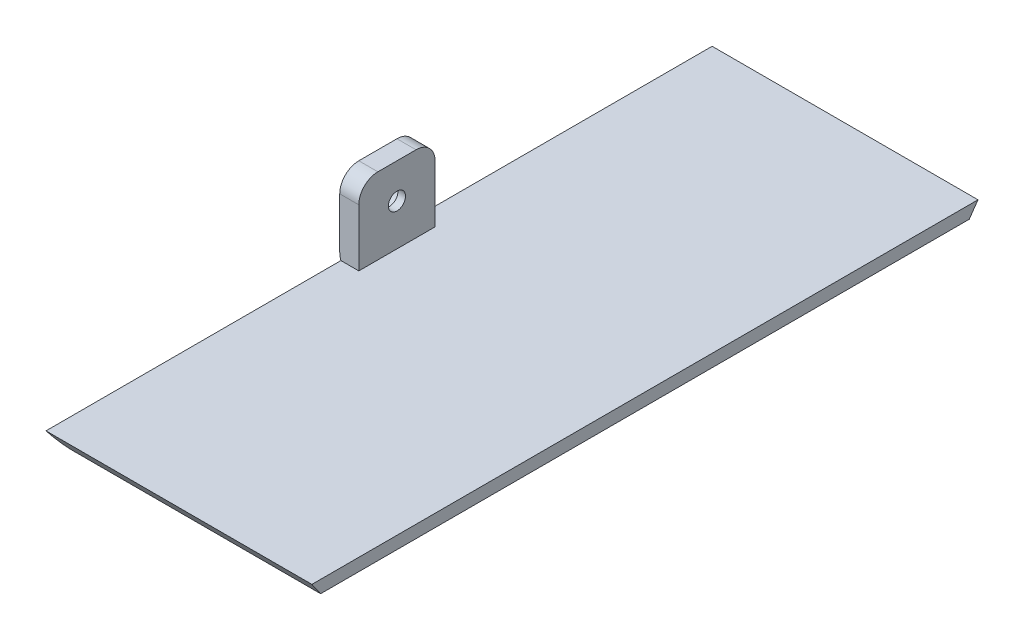
ISO-10303-21;
HEADER;
FILE_DESCRIPTION(('STEP AP214'),'2;1');
FILE_NAME('part.step','',(''),(''),'','','');
FILE_SCHEMA(('AUTOMOTIVE_DESIGN { 1 0 10303 214 1 1 1 1 }'));
ENDSEC;
DATA;
#1=APPLICATION_CONTEXT('core data for automotive mechanical design processes');
#2=APPLICATION_PROTOCOL_DEFINITION('international standard','automotive_design',2000,#1);
#3=PRODUCT_CONTEXT('',#1,'mechanical');
#4=PRODUCT('Part','Part','',(#3));
#5=PRODUCT_RELATED_PRODUCT_CATEGORY('part','',(#4));
#6=PRODUCT_DEFINITION_FORMATION('','',#4);
#7=PRODUCT_DEFINITION_CONTEXT('part definition',#1,'design');
#8=PRODUCT_DEFINITION('design','',#6,#7);
#9=PRODUCT_DEFINITION_SHAPE('','',#8);
#10=(LENGTH_UNIT() NAMED_UNIT(*) SI_UNIT(.MILLI.,.METRE.));
#11=(NAMED_UNIT(*) PLANE_ANGLE_UNIT() SI_UNIT($,.RADIAN.));
#12=(NAMED_UNIT(*) SI_UNIT($,.STERADIAN.) SOLID_ANGLE_UNIT());
#13=UNCERTAINTY_MEASURE_WITH_UNIT(LENGTH_MEASURE(1.E-05),#10,'distance_accuracy_value','');
#14=(GEOMETRIC_REPRESENTATION_CONTEXT(3) GLOBAL_UNCERTAINTY_ASSIGNED_CONTEXT((#13)) GLOBAL_UNIT_ASSIGNED_CONTEXT((#10,
#11,#12)) REPRESENTATION_CONTEXT('',''));
#15=CARTESIAN_POINT('',(0.,0.,0.));
#16=DIRECTION('',(0.,0.,1.));
#17=DIRECTION('',(1.,0.,0.));
#18=AXIS2_PLACEMENT_3D('',#15,#16,#17);
#19=CARTESIAN_POINT('',(70.001,12.5,2.65412691824451E-13));
#20=DIRECTION('',(-1.,0.,0.));
#21=DIRECTION('',(0.,0.,1.));
#22=AXIS2_PLACEMENT_3D('',#19,#20,#21);
#23=CYLINDRICAL_SURFACE('',#22,2.25);
#24=CARTESIAN_POINT('',(4.99999999999989,12.5,2.65412691824451E-13));
#25=DIRECTION('',(-1.,0.,0.));
#26=DIRECTION('',(0.,0.,1.));
#27=AXIS2_PLACEMENT_3D('',#24,#25,#26);
#28=CIRCLE('',#27,2.25);
#29=CARTESIAN_POINT('',(4.99999999999989,12.5,2.25000000000027));
#30=VERTEX_POINT('',#29);
#31=EDGE_CURVE('E173',#30,#30,#28,.F.);
#32=ORIENTED_EDGE('',*,*,#31,.T.);
#33=EDGE_LOOP('',(#32));
#34=FACE_BOUND('',#33,.T.);
#35=CARTESIAN_POINT('',(3.,12.5,2.65412691824451E-13));
#36=DIRECTION('',(-1.,0.,0.));
#37=DIRECTION('',(0.,0.,1.));
#38=AXIS2_PLACEMENT_3D('',#35,#36,#37);
#39=CIRCLE('',#38,2.25);
#40=CARTESIAN_POINT('',(3.,12.5,2.25000000000027));
#41=VERTEX_POINT('',#40);
#42=EDGE_CURVE('E228',#41,#41,#39,.F.);
#43=ORIENTED_EDGE('',*,*,#42,.F.);
#44=EDGE_LOOP('',(#43));
#45=FACE_BOUND('',#44,.T.);
#46=ADVANCED_FACE('F73',(#34,#45),#23,.F.);
#47=CARTESIAN_POINT('',(70.,1.63830408857799,-87.2943057454042));
#48=DIRECTION('',(0.,-1.,0.));
#49=DIRECTION('',(0.,0.,-1.));
#50=AXIS2_PLACEMENT_3D('',#47,#48,#49);
#51=PLANE('',#50);
#52=DIRECTION('',(0.,0.,1.));
#53=VECTOR('',#52,1.);
#54=CARTESIAN_POINT('',(0.30639577457211,1.63830408857799,-87.2943057454042));
#55=LINE('',#54,#53);
#56=CARTESIAN_POINT('',(0.306395774572101,1.63830408857801,87.2943057454042));
#57=VERTEX_POINT('',#56);
#58=CARTESIAN_POINT('',(0.30639577457211,1.63830408857799,10.0000000000003));
#59=VERTEX_POINT('',#58);
#60=EDGE_CURVE('E183',#57,#59,#55,.F.);
#61=ORIENTED_EDGE('',*,*,#60,.F.);
#62=DIRECTION('',(-1.,0.,0.));
#63=VECTOR('',#62,1.);
#64=CARTESIAN_POINT('',(70.,1.63830408857799,87.2943057454042));
#65=LINE('',#64,#63);
#66=CARTESIAN_POINT('',(70.,1.63830408857799,87.2943057454042));
#67=VERTEX_POINT('',#66);
#68=EDGE_CURVE('E217',#67,#57,#65,.T.);
#69=ORIENTED_EDGE('',*,*,#68,.F.);
#70=DIRECTION('',(0.,0.,1.));
#71=VECTOR('',#70,1.);
#72=CARTESIAN_POINT('',(70.,1.63830408857799,-87.2943057454042));
#73=LINE('',#72,#71);
#74=CARTESIAN_POINT('',(70.,1.63830408857799,-87.2943057454042));
#75=VERTEX_POINT('',#74);
#76=EDGE_CURVE('E211',#75,#67,#73,.T.);
#77=ORIENTED_EDGE('',*,*,#76,.F.);
#78=DIRECTION('',(-1.,0.,0.));
#79=VECTOR('',#78,1.);
#80=CARTESIAN_POINT('',(70.,1.63830408857799,-87.2943057454042));
#81=LINE('',#80,#79);
#82=CARTESIAN_POINT('',(0.30639577457211,1.63830408857799,-87.2943057454042));
#83=VERTEX_POINT('',#82);
#84=EDGE_CURVE('E222',#75,#83,#81,.T.);
#85=ORIENTED_EDGE('',*,*,#84,.T.);
#86=CARTESIAN_POINT('',(0.30639577457211,1.63830408857799,-9.99999999999973));
#87=VERTEX_POINT('',#86);
#88=EDGE_CURVE('E179',#87,#83,#55,.F.);
#89=ORIENTED_EDGE('',*,*,#88,.F.);
#90=DIRECTION('',(-1.,0.,0.));
#91=VECTOR('',#90,1.);
#92=CARTESIAN_POINT('',(4.9999999999999,1.63830408857799,-9.99999999999973));
#93=LINE('',#92,#91);
#94=CARTESIAN_POINT('',(4.9999999999999,1.63830408857799,-9.99999999999973));
#95=VERTEX_POINT('',#94);
#96=EDGE_CURVE('E177',#95,#87,#93,.T.);
#97=ORIENTED_EDGE('',*,*,#96,.F.);
#98=DIRECTION('',(0.,0.,-1.));
#99=VECTOR('',#98,1.);
#100=CARTESIAN_POINT('',(4.9999999999999,1.63830408857799,10.0000000000003));
#101=LINE('',#100,#99);
#102=CARTESIAN_POINT('',(4.9999999999999,1.63830408857799,10.0000000000003));
#103=VERTEX_POINT('',#102);
#104=EDGE_CURVE('E188',#103,#95,#101,.T.);
#105=ORIENTED_EDGE('',*,*,#104,.F.);
#106=DIRECTION('',(1.,0.,0.));
#107=VECTOR('',#106,1.);
#108=CARTESIAN_POINT('',(4.9999999999999,1.63830408857799,10.0000000000003));
#109=LINE('',#108,#107);
#110=EDGE_CURVE('E192',#59,#103,#109,.T.);
#111=ORIENTED_EDGE('',*,*,#110,.F.);
#112=EDGE_LOOP('',(#61,#69,#77,#85,#89,#97,#105,#111));
#113=FACE_BOUND('',#112,.T.);
#114=ADVANCED_FACE('F256',(#113),#51,.F.);
#115=CARTESIAN_POINT('',(70.,-1.63830408857799,-85.));
#116=DIRECTION('',(0.,1.,0.));
#117=DIRECTION('',(0.,0.,1.));
#118=AXIS2_PLACEMENT_3D('',#115,#116,#117);
#119=PLANE('',#118);
#120=DIRECTION('',(0.,0.,1.));
#121=VECTOR('',#120,1.);
#122=CARTESIAN_POINT('',(4.99999999999989,-1.6383040885779,-87.2943057454042));
#123=LINE('',#122,#121);
#124=CARTESIAN_POINT('',(4.99999999999989,-1.6383040885779,-85.));
#125=VERTEX_POINT('',#124);
#126=CARTESIAN_POINT('',(4.99999999999989,-1.6383040885779,85.));
#127=VERTEX_POINT('',#126);
#128=EDGE_CURVE('E174',#125,#127,#123,.T.);
#129=ORIENTED_EDGE('',*,*,#128,.F.);
#130=DIRECTION('',(-1.,0.,0.));
#131=VECTOR('',#130,1.);
#132=CARTESIAN_POINT('',(70.,-1.63830408857799,-85.));
#133=LINE('',#132,#131);
#134=CARTESIAN_POINT('',(70.,-1.63830408857799,-85.));
#135=VERTEX_POINT('',#134);
#136=EDGE_CURVE('E221',#135,#125,#133,.T.);
#137=ORIENTED_EDGE('',*,*,#136,.F.);
#138=DIRECTION('',(0.,0.,-1.));
#139=VECTOR('',#138,1.);
#140=CARTESIAN_POINT('',(70.,-1.63830408857799,-85.));
#141=LINE('',#140,#139);
#142=CARTESIAN_POINT('',(70.,-1.63830408857799,85.));
#143=VERTEX_POINT('',#142);
#144=EDGE_CURVE('E206',#143,#135,#141,.T.);
#145=ORIENTED_EDGE('',*,*,#144,.F.);
#146=DIRECTION('',(-1.,0.,0.));
#147=VECTOR('',#146,1.);
#148=CARTESIAN_POINT('',(70.,-1.63830408857799,85.));
#149=LINE('',#148,#147);
#150=EDGE_CURVE('E214',#143,#127,#149,.T.);
#151=ORIENTED_EDGE('',*,*,#150,.T.);
#152=EDGE_LOOP('',(#129,#137,#145,#151));
#153=FACE_BOUND('',#152,.T.);
#154=ADVANCED_FACE('F274',(#153),#119,.F.);
#155=CARTESIAN_POINT('',(70.,-1.63830408857799,-85.));
#156=DIRECTION('',(0.,0.573576436351049,0.819152044288989));
#157=DIRECTION('',(0.,-0.819152044288989,0.573576436351049));
#158=AXIS2_PLACEMENT_3D('',#155,#156,#157);
#159=PLANE('',#158);
#160=CARTESIAN_POINT('',(4.99999999999989,3.3616959114221,-88.5010376910486));
#161=DIRECTION('',(0.,0.573576436351049,0.819152044288989));
#162=DIRECTION('',(0.,-0.819152044288989,0.573576436351049));
#163=AXIS2_PLACEMENT_3D('',#160,#161,#162);
#164=ELLIPSE('',#163,6.10387294380723,4.99999999999994);
#165=EDGE_CURVE('E181',#83,#125,#164,.T.);
#166=ORIENTED_EDGE('',*,*,#165,.F.);
#167=ORIENTED_EDGE('',*,*,#84,.F.);
#168=DIRECTION('',(0.,0.819152044288989,-0.573576436351049));
#169=VECTOR('',#168,1.);
#170=CARTESIAN_POINT('',(70.,-1.63830408857799,-85.));
#171=LINE('',#170,#169);
#172=EDGE_CURVE('E207',#135,#75,#171,.T.);
#173=ORIENTED_EDGE('',*,*,#172,.F.);
#174=ORIENTED_EDGE('',*,*,#136,.T.);
#175=EDGE_LOOP('',(#166,#167,#173,#174));
#176=FACE_BOUND('',#175,.T.);
#177=ADVANCED_FACE('F305',(#176),#159,.F.);
#178=CARTESIAN_POINT('',(70.,-1.63830408857799,85.));
#179=DIRECTION('',(0.,0.573576436351049,-0.819152044288989));
#180=DIRECTION('',(0.,0.819152044288989,0.573576436351049));
#181=AXIS2_PLACEMENT_3D('',#178,#179,#180);
#182=PLANE('',#181);
#183=CARTESIAN_POINT('',(4.99999999999989,3.3616959114221,88.5010376910486));
#184=DIRECTION('',(0.,0.573576436351049,-0.819152044288989));
#185=DIRECTION('',(0.,0.819152044288989,0.573576436351049));
#186=AXIS2_PLACEMENT_3D('',#183,#184,#185);
#187=ELLIPSE('',#186,6.10387294380723,4.99999999999994);
#188=EDGE_CURVE('E182',#127,#57,#187,.T.);
#189=ORIENTED_EDGE('',*,*,#188,.F.);
#190=ORIENTED_EDGE('',*,*,#150,.F.);
#191=DIRECTION('',(0.,-0.819152044288989,-0.573576436351049));
#192=VECTOR('',#191,1.);
#193=CARTESIAN_POINT('',(70.,-1.63830408857799,85.));
#194=LINE('',#193,#192);
#195=EDGE_CURVE('E213',#67,#143,#194,.T.);
#196=ORIENTED_EDGE('',*,*,#195,.F.);
#197=ORIENTED_EDGE('',*,*,#68,.T.);
#198=EDGE_LOOP('',(#189,#190,#196,#197));
#199=FACE_BOUND('',#198,.T.);
#200=ADVANCED_FACE('F298',(#199),#182,.F.);
#201=CARTESIAN_POINT('',(0.,0.,0.));
#202=DIRECTION('',(-1.,0.,0.));
#203=DIRECTION('',(0.,0.,1.));
#204=AXIS2_PLACEMENT_3D('',#201,#202,#203);
#205=PLANE('',#204);
#206=CARTESIAN_POINT('',(0.,12.5,2.65412691824451E-13));
#207=DIRECTION('',(-1.,0.,0.));
#208=DIRECTION('',(0.,0.,1.));
#209=AXIS2_PLACEMENT_3D('',#206,#207,#208);
#210=CIRCLE('',#209,3.75);
#211=CARTESIAN_POINT('',(0.,12.5,3.75000000000027));
#212=VERTEX_POINT('',#211);
#213=EDGE_CURVE('E324',#212,#212,#210,.T.);
#214=ORIENTED_EDGE('',*,*,#213,.F.);
#215=EDGE_LOOP('',(#214));
#216=FACE_BOUND('',#215,.T.);
#217=DIRECTION('',(0.,-1.,0.));
#218=VECTOR('',#217,1.);
#219=CARTESIAN_POINT('',(0.,21.638304088578,10.0000000000003));
#220=LINE('',#219,#218);
#221=CARTESIAN_POINT('',(0.,16.638304088578,10.0000000000003));
#222=VERTEX_POINT('',#221);
#223=CARTESIAN_POINT('',(0.,3.36169591142201,10.0000000000003));
#224=VERTEX_POINT('',#223);
#225=EDGE_CURVE('E163',#222,#224,#220,.T.);
#226=ORIENTED_EDGE('',*,*,#225,.F.);
#227=CARTESIAN_POINT('',(0.,16.638304088578,5.00000000000026));
#228=DIRECTION('',(-1.,0.,0.));
#229=DIRECTION('',(0.,0.,1.));
#230=AXIS2_PLACEMENT_3D('',#227,#228,#229);
#231=CIRCLE('',#230,5.);
#232=CARTESIAN_POINT('',(0.,21.638304088578,5.00000000000026));
#233=VERTEX_POINT('',#232);
#234=EDGE_CURVE('E83',#222,#233,#231,.T.);
#235=ORIENTED_EDGE('',*,*,#234,.T.);
#236=DIRECTION('',(0.,0.,1.));
#237=VECTOR('',#236,1.);
#238=CARTESIAN_POINT('',(0.,21.638304088578,10.0000000000003));
#239=LINE('',#238,#237);
#240=CARTESIAN_POINT('',(0.,21.638304088578,-4.99999999999973));
#241=VERTEX_POINT('',#240);
#242=EDGE_CURVE('E193',#241,#233,#239,.T.);
#243=ORIENTED_EDGE('',*,*,#242,.F.);
#244=CARTESIAN_POINT('',(0.,16.638304088578,-4.99999999999973));
#245=DIRECTION('',(-1.,0.,0.));
#246=DIRECTION('',(0.,0.,1.));
#247=AXIS2_PLACEMENT_3D('',#244,#245,#246);
#248=CIRCLE('',#247,5.);
#249=CARTESIAN_POINT('',(0.,16.638304088578,-9.99999999999973));
#250=VERTEX_POINT('',#249);
#251=EDGE_CURVE('E89',#241,#250,#248,.T.);
#252=ORIENTED_EDGE('',*,*,#251,.T.);
#253=DIRECTION('',(0.,-1.,0.));
#254=VECTOR('',#253,1.);
#255=CARTESIAN_POINT('',(0.,21.638304088578,-9.99999999999973));
#256=LINE('',#255,#254);
#257=CARTESIAN_POINT('',(0.,3.36169591142201,-9.99999999999973));
#258=VERTEX_POINT('',#257);
#259=EDGE_CURVE('E156',#250,#258,#256,.T.);
#260=ORIENTED_EDGE('',*,*,#259,.T.);
#261=DIRECTION('',(0.,0.,1.));
#262=VECTOR('',#261,1.);
#263=CARTESIAN_POINT('',(0.,3.36169591142201,-87.2943057454042));
#264=LINE('',#263,#262);
#265=EDGE_CURVE('E157',#258,#224,#264,.T.);
#266=ORIENTED_EDGE('',*,*,#265,.T.);
#267=EDGE_LOOP('',(#226,#235,#243,#252,#260,#266));
#268=FACE_BOUND('',#267,.T.);
#269=ADVANCED_FACE('F158',(#216,#268),#205,.T.);
#270=CARTESIAN_POINT('',(4.9999999999999,21.638304088578,-9.99999999999973));
#271=DIRECTION('',(0.,0.,1.));
#272=DIRECTION('',(1.,0.,0.));
#273=AXIS2_PLACEMENT_3D('',#270,#271,#272);
#274=PLANE('',#273);
#275=ORIENTED_EDGE('',*,*,#259,.F.);
#276=DIRECTION('',(-1.,0.,0.));
#277=VECTOR('',#276,1.);
#278=CARTESIAN_POINT('',(4.9999999999999,16.638304088578,-9.99999999999973));
#279=LINE('',#278,#277);
#280=CARTESIAN_POINT('',(4.9999999999999,16.638304088578,-9.99999999999973));
#281=VERTEX_POINT('',#280);
#282=EDGE_CURVE('E12',#250,#281,#279,.F.);
#283=ORIENTED_EDGE('',*,*,#282,.T.);
#284=DIRECTION('',(0.,-1.,0.));
#285=VECTOR('',#284,1.);
#286=CARTESIAN_POINT('',(4.9999999999999,21.638304088578,-9.99999999999973));
#287=LINE('',#286,#285);
#288=EDGE_CURVE('E162',#281,#95,#287,.T.);
#289=ORIENTED_EDGE('',*,*,#288,.T.);
#290=ORIENTED_EDGE('',*,*,#96,.T.);
#291=CARTESIAN_POINT('',(4.99999999999989,3.3616959114221,-9.99999999999973));
#292=DIRECTION('',(0.,0.,1.));
#293=DIRECTION('',(1.,0.,0.));
#294=AXIS2_PLACEMENT_3D('',#291,#292,#293);
#295=CIRCLE('',#294,4.99999999999994);
#296=EDGE_CURVE('E166',#258,#87,#295,.T.);
#297=ORIENTED_EDGE('',*,*,#296,.F.);
#298=EDGE_LOOP('',(#275,#283,#289,#290,#297));
#299=FACE_BOUND('',#298,.T.);
#300=ADVANCED_FACE('F180',(#299),#274,.F.);
#301=CARTESIAN_POINT('',(4.9999999999999,21.638304088578,10.0000000000003));
#302=DIRECTION('',(0.,0.,-1.));
#303=DIRECTION('',(-1.,0.,0.));
#304=AXIS2_PLACEMENT_3D('',#301,#302,#303);
#305=PLANE('',#304);
#306=DIRECTION('',(0.,-1.,0.));
#307=VECTOR('',#306,1.);
#308=CARTESIAN_POINT('',(4.9999999999999,21.638304088578,10.0000000000003));
#309=LINE('',#308,#307);
#310=CARTESIAN_POINT('',(4.9999999999999,16.638304088578,10.0000000000003));
#311=VERTEX_POINT('',#310);
#312=EDGE_CURVE('E197',#311,#103,#309,.T.);
#313=ORIENTED_EDGE('',*,*,#312,.F.);
#314=DIRECTION('',(1.,0.,0.));
#315=VECTOR('',#314,1.);
#316=CARTESIAN_POINT('',(0.,16.638304088578,10.0000000000003));
#317=LINE('',#316,#315);
#318=EDGE_CURVE('E98',#311,#222,#317,.F.);
#319=ORIENTED_EDGE('',*,*,#318,.T.);
#320=ORIENTED_EDGE('',*,*,#225,.T.);
#321=CARTESIAN_POINT('',(4.99999999999989,3.3616959114221,10.0000000000003));
#322=DIRECTION('',(0.,0.,-1.));
#323=DIRECTION('',(-1.,0.,0.));
#324=AXIS2_PLACEMENT_3D('',#321,#322,#323);
#325=CIRCLE('',#324,4.99999999999994);
#326=EDGE_CURVE('E172',#59,#224,#325,.T.);
#327=ORIENTED_EDGE('',*,*,#326,.F.);
#328=ORIENTED_EDGE('',*,*,#110,.T.);
#329=EDGE_LOOP('',(#313,#319,#320,#327,#328));
#330=FACE_BOUND('',#329,.T.);
#331=ADVANCED_FACE('F251',(#330),#305,.F.);
#332=CARTESIAN_POINT('',(70.,0.,0.));
#333=DIRECTION('',(-1.,0.,0.));
#334=DIRECTION('',(0.,0.,1.));
#335=AXIS2_PLACEMENT_3D('',#332,#333,#334);
#336=PLANE('',#335);
#337=ORIENTED_EDGE('',*,*,#144,.T.);
#338=ORIENTED_EDGE('',*,*,#172,.T.);
#339=ORIENTED_EDGE('',*,*,#76,.T.);
#340=ORIENTED_EDGE('',*,*,#195,.T.);
#341=EDGE_LOOP('',(#337,#338,#339,#340));
#342=FACE_BOUND('',#341,.T.);
#343=ADVANCED_FACE('F288',(#342),#336,.F.);
#344=CARTESIAN_POINT('',(4.9999999999999,21.638304088578,10.0000000000003));
#345=DIRECTION('',(-1.,0.,0.));
#346=DIRECTION('',(0.,0.,1.));
#347=AXIS2_PLACEMENT_3D('',#344,#345,#346);
#348=PLANE('',#347);
#349=ORIENTED_EDGE('',*,*,#31,.F.);
#350=EDGE_LOOP('',(#349));
#351=FACE_BOUND('',#350,.T.);
#352=DIRECTION('',(0.,0.,-1.));
#353=VECTOR('',#352,1.);
#354=CARTESIAN_POINT('',(4.9999999999999,21.638304088578,10.0000000000003));
#355=LINE('',#354,#353);
#356=CARTESIAN_POINT('',(4.9999999999999,21.638304088578,5.00000000000026));
#357=VERTEX_POINT('',#356);
#358=CARTESIAN_POINT('',(4.9999999999999,21.638304088578,-4.99999999999973));
#359=VERTEX_POINT('',#358);
#360=EDGE_CURVE('E190',#357,#359,#355,.T.);
#361=ORIENTED_EDGE('',*,*,#360,.F.);
#362=CARTESIAN_POINT('',(4.9999999999999,16.638304088578,5.00000000000026));
#363=DIRECTION('',(-1.,0.,0.));
#364=DIRECTION('',(0.,0.,1.));
#365=AXIS2_PLACEMENT_3D('',#362,#363,#364);
#366=CIRCLE('',#365,5.);
#367=EDGE_CURVE('E238',#357,#311,#366,.F.);
#368=ORIENTED_EDGE('',*,*,#367,.T.);
#369=ORIENTED_EDGE('',*,*,#312,.T.);
#370=ORIENTED_EDGE('',*,*,#104,.T.);
#371=ORIENTED_EDGE('',*,*,#288,.F.);
#372=CARTESIAN_POINT('',(4.9999999999999,16.638304088578,-4.99999999999973));
#373=DIRECTION('',(-1.,0.,0.));
#374=DIRECTION('',(0.,0.,1.));
#375=AXIS2_PLACEMENT_3D('',#372,#373,#374);
#376=CIRCLE('',#375,5.);
#377=EDGE_CURVE('E236',#281,#359,#376,.F.);
#378=ORIENTED_EDGE('',*,*,#377,.T.);
#379=EDGE_LOOP('',(#361,#368,#369,#370,#371,#378));
#380=FACE_BOUND('',#379,.T.);
#381=ADVANCED_FACE('F252',(#351,#380),#348,.F.);
#382=CARTESIAN_POINT('',(0.,21.638304088578,0.));
#383=DIRECTION('',(0.,1.,0.));
#384=DIRECTION('',(0.,0.,1.));
#385=AXIS2_PLACEMENT_3D('',#382,#383,#384);
#386=PLANE('',#385);
#387=ORIENTED_EDGE('',*,*,#242,.T.);
#388=DIRECTION('',(1.,0.,0.));
#389=VECTOR('',#388,1.);
#390=CARTESIAN_POINT('',(4.9999999999999,21.638304088578,5.00000000000026));
#391=LINE('',#390,#389);
#392=EDGE_CURVE('E234',#233,#357,#391,.T.);
#393=ORIENTED_EDGE('',*,*,#392,.T.);
#394=ORIENTED_EDGE('',*,*,#360,.T.);
#395=DIRECTION('',(-1.,0.,0.));
#396=VECTOR('',#395,1.);
#397=CARTESIAN_POINT('',(0.,21.638304088578,-4.99999999999973));
#398=LINE('',#397,#396);
#399=EDGE_CURVE('E229',#359,#241,#398,.T.);
#400=ORIENTED_EDGE('',*,*,#399,.T.);
#401=EDGE_LOOP('',(#387,#393,#394,#400));
#402=FACE_BOUND('',#401,.T.);
#403=ADVANCED_FACE('F250',(#402),#386,.T.);
#404=CARTESIAN_POINT('',(4.99999999999989,3.3616959114221,-87.2943057454042));
#405=DIRECTION('',(0.,0.,1.));
#406=DIRECTION('',(1.,0.,0.));
#407=AXIS2_PLACEMENT_3D('',#404,#405,#406);
#408=CYLINDRICAL_SURFACE('',#407,4.99999999999994);
#409=ORIENTED_EDGE('',*,*,#165,.T.);
#410=ORIENTED_EDGE('',*,*,#128,.T.);
#411=ORIENTED_EDGE('',*,*,#188,.T.);
#412=ORIENTED_EDGE('',*,*,#60,.T.);
#413=ORIENTED_EDGE('',*,*,#326,.T.);
#414=ORIENTED_EDGE('',*,*,#265,.F.);
#415=ORIENTED_EDGE('',*,*,#296,.T.);
#416=ORIENTED_EDGE('',*,*,#88,.T.);
#417=EDGE_LOOP('',(#409,#410,#411,#412,#413,#414,#415,#416));
#418=FACE_BOUND('',#417,.T.);
#419=ADVANCED_FACE('F169',(#418),#408,.T.);
#420=CARTESIAN_POINT('',(3.,12.5,2.65412691824451E-13));
#421=DIRECTION('',(-1.,0.,0.));
#422=DIRECTION('',(0.,0.,1.));
#423=AXIS2_PLACEMENT_3D('',#420,#421,#422);
#424=PLANE('',#423);
#425=CARTESIAN_POINT('',(3.,12.5,2.65412691824451E-13));
#426=DIRECTION('',(-1.,0.,0.));
#427=DIRECTION('',(0.,0.,1.));
#428=AXIS2_PLACEMENT_3D('',#425,#426,#427);
#429=CIRCLE('',#428,3.75);
#430=CARTESIAN_POINT('',(3.,12.5,3.75000000000027));
#431=VERTEX_POINT('',#430);
#432=EDGE_CURVE('E235',#431,#431,#429,.T.);
#433=ORIENTED_EDGE('',*,*,#432,.T.);
#434=EDGE_LOOP('',(#433));
#435=FACE_BOUND('',#434,.T.);
#436=ORIENTED_EDGE('',*,*,#42,.T.);
#437=EDGE_LOOP('',(#436));
#438=FACE_BOUND('',#437,.T.);
#439=ADVANCED_FACE('F284',(#435,#438),#424,.T.);
#440=CARTESIAN_POINT('',(3.,12.5,2.65412691824451E-13));
#441=DIRECTION('',(-1.,0.,0.));
#442=DIRECTION('',(0.,0.,1.));
#443=AXIS2_PLACEMENT_3D('',#440,#441,#442);
#444=CYLINDRICAL_SURFACE('',#443,3.75);
#445=ORIENTED_EDGE('',*,*,#432,.F.);
#446=EDGE_LOOP('',(#445));
#447=FACE_BOUND('',#446,.T.);
#448=ORIENTED_EDGE('',*,*,#213,.T.);
#449=EDGE_LOOP('',(#448));
#450=FACE_BOUND('',#449,.T.);
#451=ADVANCED_FACE('F266',(#447,#450),#444,.F.);
#452=CARTESIAN_POINT('',(0.,16.638304088578,5.00000000000026));
#453=DIRECTION('',(-1.,0.,0.));
#454=DIRECTION('',(0.,0.,1.));
#455=AXIS2_PLACEMENT_3D('',#452,#453,#454);
#456=CYLINDRICAL_SURFACE('',#455,5.);
#457=ORIENTED_EDGE('',*,*,#234,.F.);
#458=ORIENTED_EDGE('',*,*,#318,.F.);
#459=ORIENTED_EDGE('',*,*,#367,.F.);
#460=ORIENTED_EDGE('',*,*,#392,.F.);
#461=EDGE_LOOP('',(#457,#458,#459,#460));
#462=FACE_BOUND('',#461,.T.);
#463=ADVANCED_FACE('F249',(#462),#456,.T.);
#464=CARTESIAN_POINT('',(0.,16.638304088578,-4.99999999999973));
#465=DIRECTION('',(1.,0.,0.));
#466=DIRECTION('',(0.,0.,-1.));
#467=AXIS2_PLACEMENT_3D('',#464,#465,#466);
#468=CYLINDRICAL_SURFACE('',#467,5.);
#469=ORIENTED_EDGE('',*,*,#377,.F.);
#470=ORIENTED_EDGE('',*,*,#282,.F.);
#471=ORIENTED_EDGE('',*,*,#251,.F.);
#472=ORIENTED_EDGE('',*,*,#399,.F.);
#473=EDGE_LOOP('',(#469,#470,#471,#472));
#474=FACE_BOUND('',#473,.T.);
#475=ADVANCED_FACE('F77',(#474),#468,.T.);
#476=CLOSED_SHELL('',(#46,#114,#154,#177,#200,#269,#300,#331,#343,#381,#403,#419,#439,#451,#463,#475));
#477=MANIFOLD_SOLID_BREP('B2',#476);
#478=ADVANCED_BREP_SHAPE_REPRESENTATION('',(#18,#477),#14);
#479=SHAPE_DEFINITION_REPRESENTATION(#9,#478);
ENDSEC;
END-ISO-10303-21;
